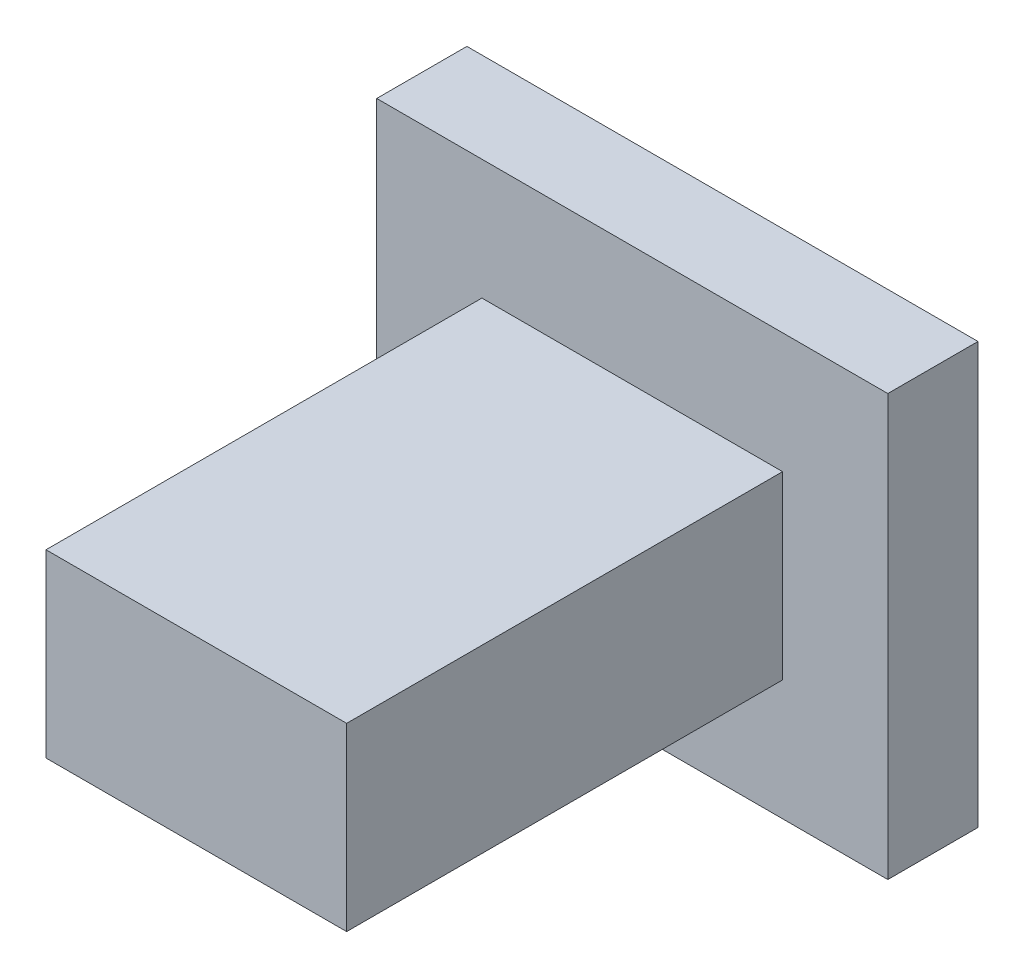
ISO-10303-21;
HEADER;
FILE_DESCRIPTION(('STEP AP214'),'2;1');
FILE_NAME('part.step','',(''),(''),'','','');
FILE_SCHEMA(('AUTOMOTIVE_DESIGN { 1 0 10303 214 1 1 1 1 }'));
ENDSEC;
DATA;
#1=APPLICATION_CONTEXT('core data for automotive mechanical design processes');
#2=APPLICATION_PROTOCOL_DEFINITION('international standard','automotive_design',2000,#1);
#3=PRODUCT_CONTEXT('',#1,'mechanical');
#4=PRODUCT('Part','Part','',(#3));
#5=PRODUCT_RELATED_PRODUCT_CATEGORY('part','',(#4));
#6=PRODUCT_DEFINITION_FORMATION('','',#4);
#7=PRODUCT_DEFINITION_CONTEXT('part definition',#1,'design');
#8=PRODUCT_DEFINITION('design','',#6,#7);
#9=PRODUCT_DEFINITION_SHAPE('','',#8);
#10=(LENGTH_UNIT() NAMED_UNIT(*) SI_UNIT(.MILLI.,.METRE.));
#11=(NAMED_UNIT(*) PLANE_ANGLE_UNIT() SI_UNIT($,.RADIAN.));
#12=(NAMED_UNIT(*) SI_UNIT($,.STERADIAN.) SOLID_ANGLE_UNIT());
#13=UNCERTAINTY_MEASURE_WITH_UNIT(LENGTH_MEASURE(1.E-05),#10,'distance_accuracy_value','');
#14=(GEOMETRIC_REPRESENTATION_CONTEXT(3) GLOBAL_UNCERTAINTY_ASSIGNED_CONTEXT((#13)) GLOBAL_UNIT_ASSIGNED_CONTEXT((#10,
#11,#12)) REPRESENTATION_CONTEXT('',''));
#15=CARTESIAN_POINT('',(0.,0.,0.));
#16=DIRECTION('',(0.,0.,1.));
#17=DIRECTION('',(1.,0.,0.));
#18=AXIS2_PLACEMENT_3D('',#15,#16,#17);
#19=CARTESIAN_POINT('',(0.,0.,1.5));
#20=DIRECTION('',(-1.,0.,0.));
#21=DIRECTION('',(0.,0.,1.));
#22=AXIS2_PLACEMENT_3D('',#19,#20,#21);
#23=PLANE('',#22);
#24=DIRECTION('',(0.,0.,-1.));
#25=VECTOR('',#24,1.);
#26=CARTESIAN_POINT('',(0.,2.175,2.25));
#27=LINE('',#26,#25);
#28=CARTESIAN_POINT('',(0.,2.175,1.5));
#29=VERTEX_POINT('',#28);
#30=CARTESIAN_POINT('',(0.,2.175,0.));
#31=VERTEX_POINT('',#30);
#32=EDGE_CURVE('E54',#29,#31,#27,.T.);
#33=ORIENTED_EDGE('',*,*,#32,.F.);
#34=DIRECTION('',(0.,1.,0.));
#35=VECTOR('',#34,1.);
#36=CARTESIAN_POINT('',(0.,0.,1.5));
#37=LINE('',#36,#35);
#38=CARTESIAN_POINT('',(0.,0.825,1.5));
#39=VERTEX_POINT('',#38);
#40=EDGE_CURVE('E58',#39,#29,#37,.T.);
#41=ORIENTED_EDGE('',*,*,#40,.F.);
#42=DIRECTION('',(0.,0.,-1.));
#43=VECTOR('',#42,1.);
#44=CARTESIAN_POINT('',(0.,0.825,2.25));
#45=LINE('',#44,#43);
#46=CARTESIAN_POINT('',(0.,0.825,0.));
#47=VERTEX_POINT('',#46);
#48=EDGE_CURVE('E190',#39,#47,#45,.T.);
#49=ORIENTED_EDGE('',*,*,#48,.T.);
#50=DIRECTION('',(0.,1.,0.));
#51=VECTOR('',#50,1.);
#52=CARTESIAN_POINT('',(0.,0.,0.));
#53=LINE('',#52,#51);
#54=EDGE_CURVE('E205',#47,#31,#53,.T.);
#55=ORIENTED_EDGE('',*,*,#54,.T.);
#56=EDGE_LOOP('',(#33,#41,#49,#55));
#57=FACE_BOUND('',#56,.T.);
#58=ADVANCED_FACE('F37',(#57),#23,.F.);
#59=CARTESIAN_POINT('',(0.,-2.,1.5));
#60=DIRECTION('',(0.,1.,0.));
#61=DIRECTION('',(-1.,0.,0.));
#62=AXIS2_PLACEMENT_3D('',#59,#60,#61);
#63=PLANE('',#62);
#64=DIRECTION('',(1.,0.,0.));
#65=VECTOR('',#64,1.);
#66=CARTESIAN_POINT('',(0.,-2.,0.));
#67=LINE('',#66,#65);
#68=CARTESIAN_POINT('',(-1.75,-2.,0.));
#69=VERTEX_POINT('',#68);
#70=CARTESIAN_POINT('',(6.75,-2.,0.));
#71=VERTEX_POINT('',#70);
#72=EDGE_CURVE('E228',#69,#71,#67,.T.);
#73=ORIENTED_EDGE('',*,*,#72,.T.);
#74=DIRECTION('',(0.,0.,-1.));
#75=VECTOR('',#74,1.);
#76=CARTESIAN_POINT('',(6.75,-2.,1.5));
#77=LINE('',#76,#75);
#78=CARTESIAN_POINT('',(6.75,-2.,1.5));
#79=VERTEX_POINT('',#78);
#80=EDGE_CURVE('E11',#79,#71,#77,.T.);
#81=ORIENTED_EDGE('',*,*,#80,.F.);
#82=DIRECTION('',(1.,0.,0.));
#83=VECTOR('',#82,1.);
#84=CARTESIAN_POINT('',(0.,-2.,1.5));
#85=LINE('',#84,#83);
#86=CARTESIAN_POINT('',(-1.75,-2.,1.5));
#87=VERTEX_POINT('',#86);
#88=EDGE_CURVE('E215',#87,#79,#85,.T.);
#89=ORIENTED_EDGE('',*,*,#88,.F.);
#90=DIRECTION('',(0.,0.,-1.));
#91=VECTOR('',#90,1.);
#92=CARTESIAN_POINT('',(-1.75,-2.,1.5));
#93=LINE('',#92,#91);
#94=EDGE_CURVE('E226',#87,#69,#93,.T.);
#95=ORIENTED_EDGE('',*,*,#94,.T.);
#96=EDGE_LOOP('',(#73,#81,#89,#95));
#97=FACE_BOUND('',#96,.T.);
#98=ADVANCED_FACE('F268',(#97),#63,.F.);
#99=CARTESIAN_POINT('',(6.75,0.,1.5));
#100=DIRECTION('',(-1.,0.,0.));
#101=DIRECTION('',(0.,-1.,0.));
#102=AXIS2_PLACEMENT_3D('',#99,#100,#101);
#103=PLANE('',#102);
#104=DIRECTION('',(0.,1.,0.));
#105=VECTOR('',#104,1.);
#106=CARTESIAN_POINT('',(6.75,0.,0.));
#107=LINE('',#106,#105);
#108=CARTESIAN_POINT('',(6.75,5.,0.));
#109=VERTEX_POINT('',#108);
#110=EDGE_CURVE('E231',#71,#109,#107,.T.);
#111=ORIENTED_EDGE('',*,*,#110,.T.);
#112=DIRECTION('',(0.,0.,-1.));
#113=VECTOR('',#112,1.);
#114=CARTESIAN_POINT('',(6.75,5.,1.5));
#115=LINE('',#114,#113);
#116=CARTESIAN_POINT('',(6.75,5.,1.5));
#117=VERTEX_POINT('',#116);
#118=EDGE_CURVE('E46',#117,#109,#115,.T.);
#119=ORIENTED_EDGE('',*,*,#118,.F.);
#120=DIRECTION('',(0.,1.,0.));
#121=VECTOR('',#120,1.);
#122=CARTESIAN_POINT('',(6.75,0.,1.5));
#123=LINE('',#122,#121);
#124=EDGE_CURVE('E218',#79,#117,#123,.T.);
#125=ORIENTED_EDGE('',*,*,#124,.F.);
#126=ORIENTED_EDGE('',*,*,#80,.T.);
#127=EDGE_LOOP('',(#111,#119,#125,#126));
#128=FACE_BOUND('',#127,.T.);
#129=ADVANCED_FACE('F272',(#128),#103,.F.);
#130=CARTESIAN_POINT('',(0.,5.,1.5));
#131=DIRECTION('',(0.,1.,0.));
#132=DIRECTION('',(-1.,0.,0.));
#133=AXIS2_PLACEMENT_3D('',#130,#131,#132);
#134=PLANE('',#133);
#135=DIRECTION('',(1.,0.,0.));
#136=VECTOR('',#135,1.);
#137=CARTESIAN_POINT('',(0.,5.,0.));
#138=LINE('',#137,#136);
#139=CARTESIAN_POINT('',(-1.75,5.,0.));
#140=VERTEX_POINT('',#139);
#141=EDGE_CURVE('E234',#140,#109,#138,.T.);
#142=ORIENTED_EDGE('',*,*,#141,.F.);
#143=DIRECTION('',(0.,0.,-1.));
#144=VECTOR('',#143,1.);
#145=CARTESIAN_POINT('',(-1.75,5.,1.5));
#146=LINE('',#145,#144);
#147=CARTESIAN_POINT('',(-1.75,5.,1.5));
#148=VERTEX_POINT('',#147);
#149=EDGE_CURVE('E240',#148,#140,#146,.T.);
#150=ORIENTED_EDGE('',*,*,#149,.F.);
#151=DIRECTION('',(1.,0.,0.));
#152=VECTOR('',#151,1.);
#153=CARTESIAN_POINT('',(0.,5.,1.5));
#154=LINE('',#153,#152);
#155=EDGE_CURVE('E220',#148,#117,#154,.T.);
#156=ORIENTED_EDGE('',*,*,#155,.T.);
#157=ORIENTED_EDGE('',*,*,#118,.T.);
#158=EDGE_LOOP('',(#142,#150,#156,#157));
#159=FACE_BOUND('',#158,.T.);
#160=ADVANCED_FACE('F277',(#159),#134,.T.);
#161=CARTESIAN_POINT('',(-1.75,0.,1.5));
#162=DIRECTION('',(-1.,0.,0.));
#163=DIRECTION('',(0.,-1.,0.));
#164=AXIS2_PLACEMENT_3D('',#161,#162,#163);
#165=PLANE('',#164);
#166=DIRECTION('',(0.,1.,0.));
#167=VECTOR('',#166,1.);
#168=CARTESIAN_POINT('',(-1.75,0.,0.));
#169=LINE('',#168,#167);
#170=EDGE_CURVE('E208',#69,#140,#169,.T.);
#171=ORIENTED_EDGE('',*,*,#170,.F.);
#172=ORIENTED_EDGE('',*,*,#94,.F.);
#173=DIRECTION('',(0.,1.,0.));
#174=VECTOR('',#173,1.);
#175=CARTESIAN_POINT('',(-1.75,0.,1.5));
#176=LINE('',#175,#174);
#177=EDGE_CURVE('E223',#87,#148,#176,.T.);
#178=ORIENTED_EDGE('',*,*,#177,.T.);
#179=ORIENTED_EDGE('',*,*,#149,.T.);
#180=EDGE_LOOP('',(#171,#172,#178,#179));
#181=FACE_BOUND('',#180,.T.);
#182=ADVANCED_FACE('F283',(#181),#165,.T.);
#183=CARTESIAN_POINT('',(0.,0.,1.5));
#184=DIRECTION('',(0.,0.,1.));
#185=DIRECTION('',(1.,0.,0.));
#186=AXIS2_PLACEMENT_3D('',#183,#184,#185);
#187=PLANE('',#186);
#188=DIRECTION('',(0.,1.,0.));
#189=VECTOR('',#188,1.);
#190=CARTESIAN_POINT('',(5.,0.,1.5));
#191=LINE('',#190,#189);
#192=CARTESIAN_POINT('',(5.,0.,1.5));
#193=VERTEX_POINT('',#192);
#194=CARTESIAN_POINT('',(5.,3.,1.5));
#195=VERTEX_POINT('',#194);
#196=EDGE_CURVE('E139',#193,#195,#191,.T.);
#197=ORIENTED_EDGE('',*,*,#196,.F.);
#198=DIRECTION('',(1.,0.,0.));
#199=VECTOR('',#198,1.);
#200=CARTESIAN_POINT('',(0.,0.,1.5));
#201=LINE('',#200,#199);
#202=CARTESIAN_POINT('',(0.,0.,1.5));
#203=VERTEX_POINT('',#202);
#204=EDGE_CURVE('E207',#203,#193,#201,.T.);
#205=ORIENTED_EDGE('',*,*,#204,.F.);
#206=EDGE_CURVE('E211',#203,#39,#37,.T.);
#207=ORIENTED_EDGE('',*,*,#206,.T.);
#208=ORIENTED_EDGE('',*,*,#40,.T.);
#209=DIRECTION('',(0.,-1.,0.));
#210=VECTOR('',#209,1.);
#211=CARTESIAN_POINT('',(0.,0.,1.5));
#212=LINE('',#211,#210);
#213=CARTESIAN_POINT('',(0.,3.,1.5));
#214=VERTEX_POINT('',#213);
#215=EDGE_CURVE('E202',#214,#29,#212,.T.);
#216=ORIENTED_EDGE('',*,*,#215,.F.);
#217=DIRECTION('',(1.,0.,0.));
#218=VECTOR('',#217,1.);
#219=CARTESIAN_POINT('',(0.,3.,1.5));
#220=LINE('',#219,#218);
#221=EDGE_CURVE('E213',#214,#195,#220,.T.);
#222=ORIENTED_EDGE('',*,*,#221,.T.);
#223=EDGE_LOOP('',(#197,#205,#207,#208,#216,#222));
#224=FACE_BOUND('',#223,.T.);
#225=ORIENTED_EDGE('',*,*,#88,.T.);
#226=ORIENTED_EDGE('',*,*,#124,.T.);
#227=ORIENTED_EDGE('',*,*,#155,.F.);
#228=ORIENTED_EDGE('',*,*,#177,.F.);
#229=EDGE_LOOP('',(#225,#226,#227,#228));
#230=FACE_BOUND('',#229,.T.);
#231=ADVANCED_FACE('F287',(#224,#230),#187,.T.);
#232=CARTESIAN_POINT('',(0.,0.,0.));
#233=DIRECTION('',(0.,0.,1.));
#234=DIRECTION('',(1.,0.,0.));
#235=AXIS2_PLACEMENT_3D('',#232,#233,#234);
#236=PLANE('',#235);
#237=ORIENTED_EDGE('',*,*,#54,.F.);
#238=DIRECTION('',(1.,0.,0.));
#239=VECTOR('',#238,1.);
#240=CARTESIAN_POINT('',(0.,0.825,0.));
#241=LINE('',#240,#239);
#242=CARTESIAN_POINT('',(1.35,0.825,0.));
#243=VERTEX_POINT('',#242);
#244=EDGE_CURVE('E177',#47,#243,#241,.T.);
#245=ORIENTED_EDGE('',*,*,#244,.T.);
#246=DIRECTION('',(0.,-1.,0.));
#247=VECTOR('',#246,1.);
#248=CARTESIAN_POINT('',(1.35,0.,0.));
#249=LINE('',#248,#247);
#250=CARTESIAN_POINT('',(1.35,2.175,0.));
#251=VERTEX_POINT('',#250);
#252=EDGE_CURVE('E174',#251,#243,#249,.T.);
#253=ORIENTED_EDGE('',*,*,#252,.F.);
#254=DIRECTION('',(1.,0.,0.));
#255=VECTOR('',#254,1.);
#256=CARTESIAN_POINT('',(0.,2.175,0.));
#257=LINE('',#256,#255);
#258=EDGE_CURVE('E165',#31,#251,#257,.T.);
#259=ORIENTED_EDGE('',*,*,#258,.F.);
#260=EDGE_LOOP('',(#237,#245,#253,#259));
#261=FACE_BOUND('',#260,.T.);
#262=ORIENTED_EDGE('',*,*,#72,.F.);
#263=ORIENTED_EDGE('',*,*,#170,.T.);
#264=ORIENTED_EDGE('',*,*,#141,.T.);
#265=ORIENTED_EDGE('',*,*,#110,.F.);
#266=EDGE_LOOP('',(#262,#263,#264,#265));
#267=FACE_BOUND('',#266,.T.);
#268=ADVANCED_FACE('F265',(#261,#267),#236,.F.);
#269=CARTESIAN_POINT('',(0.,2.175,2.25));
#270=DIRECTION('',(0.,1.,0.));
#271=DIRECTION('',(-1.,0.,0.));
#272=AXIS2_PLACEMENT_3D('',#269,#270,#271);
#273=PLANE('',#272);
#274=ORIENTED_EDGE('',*,*,#258,.T.);
#275=DIRECTION('',(0.,0.,-1.));
#276=VECTOR('',#275,1.);
#277=CARTESIAN_POINT('',(1.35,2.175,2.25));
#278=LINE('',#277,#276);
#279=CARTESIAN_POINT('',(1.35,2.175,2.25));
#280=VERTEX_POINT('',#279);
#281=EDGE_CURVE('E199',#280,#251,#278,.T.);
#282=ORIENTED_EDGE('',*,*,#281,.F.);
#283=DIRECTION('',(1.,0.,0.));
#284=VECTOR('',#283,1.);
#285=CARTESIAN_POINT('',(0.,2.175,2.25));
#286=LINE('',#285,#284);
#287=CARTESIAN_POINT('',(0.,2.175,2.25));
#288=VERTEX_POINT('',#287);
#289=EDGE_CURVE('E40',#288,#280,#286,.T.);
#290=ORIENTED_EDGE('',*,*,#289,.F.);
#291=EDGE_CURVE('E182',#288,#29,#27,.T.);
#292=ORIENTED_EDGE('',*,*,#291,.T.);
#293=ORIENTED_EDGE('',*,*,#32,.T.);
#294=EDGE_LOOP('',(#274,#282,#290,#292,#293));
#295=FACE_BOUND('',#294,.T.);
#296=ADVANCED_FACE('F259',(#295),#273,.F.);
#297=CARTESIAN_POINT('',(1.35,0.,2.25));
#298=DIRECTION('',(1.,0.,0.));
#299=DIRECTION('',(0.,0.,-1.));
#300=AXIS2_PLACEMENT_3D('',#297,#298,#299);
#301=PLANE('',#300);
#302=ORIENTED_EDGE('',*,*,#252,.T.);
#303=DIRECTION('',(0.,0.,-1.));
#304=VECTOR('',#303,1.);
#305=CARTESIAN_POINT('',(1.35,0.825,2.25));
#306=LINE('',#305,#304);
#307=CARTESIAN_POINT('',(1.35,0.825,2.25));
#308=VERTEX_POINT('',#307);
#309=EDGE_CURVE('E189',#308,#243,#306,.T.);
#310=ORIENTED_EDGE('',*,*,#309,.F.);
#311=DIRECTION('',(0.,-1.,0.));
#312=VECTOR('',#311,1.);
#313=CARTESIAN_POINT('',(1.35,0.,2.25));
#314=LINE('',#313,#312);
#315=EDGE_CURVE('E169',#280,#308,#314,.T.);
#316=ORIENTED_EDGE('',*,*,#315,.F.);
#317=ORIENTED_EDGE('',*,*,#281,.T.);
#318=EDGE_LOOP('',(#302,#310,#316,#317));
#319=FACE_BOUND('',#318,.T.);
#320=ADVANCED_FACE('F261',(#319),#301,.F.);
#321=CARTESIAN_POINT('',(0.,0.825,2.25));
#322=DIRECTION('',(0.,1.,0.));
#323=DIRECTION('',(0.,0.,1.));
#324=AXIS2_PLACEMENT_3D('',#321,#322,#323);
#325=PLANE('',#324);
#326=ORIENTED_EDGE('',*,*,#244,.F.);
#327=ORIENTED_EDGE('',*,*,#48,.F.);
#328=CARTESIAN_POINT('',(0.,0.825,2.25));
#329=VERTEX_POINT('',#328);
#330=EDGE_CURVE('E185',#329,#39,#45,.T.);
#331=ORIENTED_EDGE('',*,*,#330,.F.);
#332=DIRECTION('',(1.,0.,0.));
#333=VECTOR('',#332,1.);
#334=CARTESIAN_POINT('',(0.,0.825,2.25));
#335=LINE('',#334,#333);
#336=EDGE_CURVE('E171',#329,#308,#335,.T.);
#337=ORIENTED_EDGE('',*,*,#336,.T.);
#338=ORIENTED_EDGE('',*,*,#309,.T.);
#339=EDGE_LOOP('',(#326,#327,#331,#337,#338));
#340=FACE_BOUND('',#339,.T.);
#341=ADVANCED_FACE('F246',(#340),#325,.T.);
#342=CARTESIAN_POINT('',(0.,0.,2.25));
#343=DIRECTION('',(-1.,0.,0.));
#344=DIRECTION('',(0.,0.,1.));
#345=AXIS2_PLACEMENT_3D('',#342,#343,#344);
#346=PLANE('',#345);
#347=ORIENTED_EDGE('',*,*,#330,.T.);
#348=ORIENTED_EDGE('',*,*,#206,.F.);
#349=DIRECTION('',(0.,0.,-1.));
#350=VECTOR('',#349,1.);
#351=CARTESIAN_POINT('',(0.,0.,2.25));
#352=LINE('',#351,#350);
#353=CARTESIAN_POINT('',(0.,0.,8.75));
#354=VERTEX_POINT('',#353);
#355=EDGE_CURVE('E196',#354,#203,#352,.T.);
#356=ORIENTED_EDGE('',*,*,#355,.F.);
#357=DIRECTION('',(0.,-1.,0.));
#358=VECTOR('',#357,1.);
#359=CARTESIAN_POINT('',(0.,3.,8.75));
#360=LINE('',#359,#358);
#361=CARTESIAN_POINT('',(0.,3.,8.75));
#362=VERTEX_POINT('',#361);
#363=EDGE_CURVE('E152',#362,#354,#360,.T.);
#364=ORIENTED_EDGE('',*,*,#363,.F.);
#365=DIRECTION('',(0.,0.,-1.));
#366=VECTOR('',#365,1.);
#367=CARTESIAN_POINT('',(0.,3.,2.25));
#368=LINE('',#367,#366);
#369=EDGE_CURVE('E143',#362,#214,#368,.T.);
#370=ORIENTED_EDGE('',*,*,#369,.T.);
#371=ORIENTED_EDGE('',*,*,#215,.T.);
#372=ORIENTED_EDGE('',*,*,#291,.F.);
#373=DIRECTION('',(0.,-1.,0.));
#374=VECTOR('',#373,1.);
#375=CARTESIAN_POINT('',(0.,3.,2.25));
#376=LINE('',#375,#374);
#377=EDGE_CURVE('E158',#288,#329,#376,.T.);
#378=ORIENTED_EDGE('',*,*,#377,.T.);
#379=EDGE_LOOP('',(#347,#348,#356,#364,#370,#371,#372,#378));
#380=FACE_BOUND('',#379,.T.);
#381=ADVANCED_FACE('F254',(#380),#346,.T.);
#382=CARTESIAN_POINT('',(0.,0.,2.25));
#383=DIRECTION('',(0.,1.,0.));
#384=DIRECTION('',(-1.,0.,0.));
#385=AXIS2_PLACEMENT_3D('',#382,#383,#384);
#386=PLANE('',#385);
#387=ORIENTED_EDGE('',*,*,#204,.T.);
#388=DIRECTION('',(0.,0.,-1.));
#389=VECTOR('',#388,1.);
#390=CARTESIAN_POINT('',(5.,0.,2.25));
#391=LINE('',#390,#389);
#392=CARTESIAN_POINT('',(5.,0.,8.75));
#393=VERTEX_POINT('',#392);
#394=EDGE_CURVE('E142',#393,#193,#391,.T.);
#395=ORIENTED_EDGE('',*,*,#394,.F.);
#396=DIRECTION('',(1.,0.,0.));
#397=VECTOR('',#396,1.);
#398=CARTESIAN_POINT('',(5.,0.,8.75));
#399=LINE('',#398,#397);
#400=EDGE_CURVE('E157',#354,#393,#399,.T.);
#401=ORIENTED_EDGE('',*,*,#400,.F.);
#402=ORIENTED_EDGE('',*,*,#355,.T.);
#403=EDGE_LOOP('',(#387,#395,#401,#402));
#404=FACE_BOUND('',#403,.T.);
#405=ADVANCED_FACE('F300',(#404),#386,.F.);
#406=CARTESIAN_POINT('',(5.,0.,2.25));
#407=DIRECTION('',(-1.,0.,0.));
#408=DIRECTION('',(0.,0.,1.));
#409=AXIS2_PLACEMENT_3D('',#406,#407,#408);
#410=PLANE('',#409);
#411=ORIENTED_EDGE('',*,*,#196,.T.);
#412=DIRECTION('',(0.,0.,-1.));
#413=VECTOR('',#412,1.);
#414=CARTESIAN_POINT('',(5.,3.,2.25));
#415=LINE('',#414,#413);
#416=CARTESIAN_POINT('',(5.,3.,8.75));
#417=VERTEX_POINT('',#416);
#418=EDGE_CURVE('E133',#417,#195,#415,.T.);
#419=ORIENTED_EDGE('',*,*,#418,.F.);
#420=DIRECTION('',(0.,1.,0.));
#421=VECTOR('',#420,1.);
#422=CARTESIAN_POINT('',(5.,3.,8.75));
#423=LINE('',#422,#421);
#424=EDGE_CURVE('E138',#393,#417,#423,.T.);
#425=ORIENTED_EDGE('',*,*,#424,.F.);
#426=ORIENTED_EDGE('',*,*,#394,.T.);
#427=EDGE_LOOP('',(#411,#419,#425,#426));
#428=FACE_BOUND('',#427,.T.);
#429=ADVANCED_FACE('F135',(#428),#410,.F.);
#430=CARTESIAN_POINT('',(0.,3.,2.25));
#431=DIRECTION('',(0.,1.,0.));
#432=DIRECTION('',(-1.,0.,0.));
#433=AXIS2_PLACEMENT_3D('',#430,#431,#432);
#434=PLANE('',#433);
#435=ORIENTED_EDGE('',*,*,#418,.T.);
#436=ORIENTED_EDGE('',*,*,#221,.F.);
#437=ORIENTED_EDGE('',*,*,#369,.F.);
#438=DIRECTION('',(-1.,0.,0.));
#439=VECTOR('',#438,1.);
#440=CARTESIAN_POINT('',(5.,3.,8.75));
#441=LINE('',#440,#439);
#442=EDGE_CURVE('E146',#417,#362,#441,.T.);
#443=ORIENTED_EDGE('',*,*,#442,.F.);
#444=EDGE_LOOP('',(#435,#436,#437,#443));
#445=FACE_BOUND('',#444,.T.);
#446=ADVANCED_FACE('F147',(#445),#434,.T.);
#447=CARTESIAN_POINT('',(0.,0.,8.75));
#448=DIRECTION('',(0.,0.,-1.));
#449=DIRECTION('',(-1.,0.,0.));
#450=AXIS2_PLACEMENT_3D('',#447,#448,#449);
#451=PLANE('',#450);
#452=ORIENTED_EDGE('',*,*,#424,.T.);
#453=ORIENTED_EDGE('',*,*,#442,.T.);
#454=ORIENTED_EDGE('',*,*,#363,.T.);
#455=ORIENTED_EDGE('',*,*,#400,.T.);
#456=EDGE_LOOP('',(#452,#453,#454,#455));
#457=FACE_BOUND('',#456,.T.);
#458=ADVANCED_FACE('F155',(#457),#451,.F.);
#459=CARTESIAN_POINT('',(0.,0.,2.25));
#460=DIRECTION('',(0.,0.,-1.));
#461=DIRECTION('',(-1.,0.,0.));
#462=AXIS2_PLACEMENT_3D('',#459,#460,#461);
#463=PLANE('',#462);
#464=ORIENTED_EDGE('',*,*,#377,.F.);
#465=ORIENTED_EDGE('',*,*,#289,.T.);
#466=ORIENTED_EDGE('',*,*,#315,.T.);
#467=ORIENTED_EDGE('',*,*,#336,.F.);
#468=EDGE_LOOP('',(#464,#465,#466,#467));
#469=FACE_BOUND('',#468,.T.);
#470=ADVANCED_FACE('F250',(#469),#463,.T.);
#471=CLOSED_SHELL('',(#58,#98,#129,#160,#182,#231,#268,#296,#320,#341,#381,#405,#429,#446,#458,#470));
#472=MANIFOLD_SOLID_BREP('B2',#471);
#473=ADVANCED_BREP_SHAPE_REPRESENTATION('',(#18,#472),#14);
#474=SHAPE_DEFINITION_REPRESENTATION(#9,#473);
ENDSEC;
END-ISO-10303-21;
